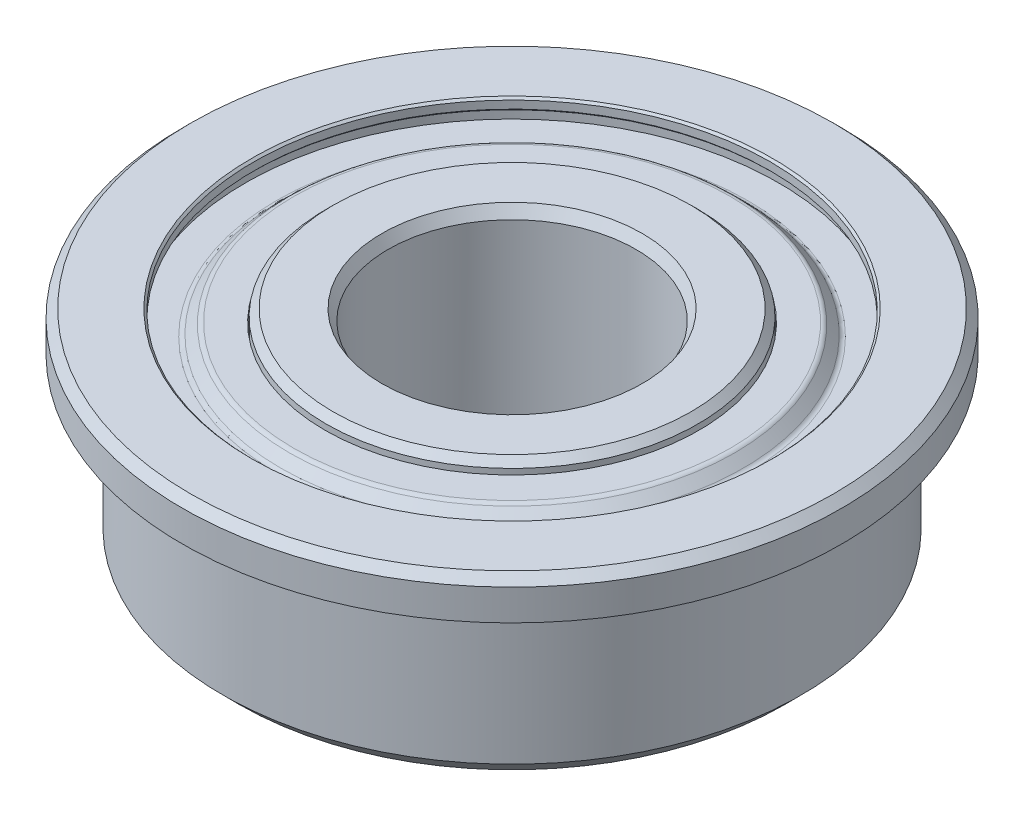
ISO-10303-21;
HEADER;
FILE_DESCRIPTION(('STEP AP214'),'2;1');
FILE_NAME('part.step','',(''),(''),'','','');
FILE_SCHEMA(('AUTOMOTIVE_DESIGN { 1 0 10303 214 1 1 1 1 }'));
ENDSEC;
DATA;
#1=APPLICATION_CONTEXT('core data for automotive mechanical design processes');
#2=APPLICATION_PROTOCOL_DEFINITION('international standard','automotive_design',2000,#1);
#3=PRODUCT_CONTEXT('',#1,'mechanical');
#4=PRODUCT('Part','Part','',(#3));
#5=PRODUCT_RELATED_PRODUCT_CATEGORY('part','',(#4));
#6=PRODUCT_DEFINITION_FORMATION('','',#4);
#7=PRODUCT_DEFINITION_CONTEXT('part definition',#1,'design');
#8=PRODUCT_DEFINITION('design','',#6,#7);
#9=PRODUCT_DEFINITION_SHAPE('','',#8);
#10=(LENGTH_UNIT() NAMED_UNIT(*) SI_UNIT(.MILLI.,.METRE.));
#11=(NAMED_UNIT(*) PLANE_ANGLE_UNIT() SI_UNIT($,.RADIAN.));
#12=(NAMED_UNIT(*) SI_UNIT($,.STERADIAN.) SOLID_ANGLE_UNIT());
#13=UNCERTAINTY_MEASURE_WITH_UNIT(LENGTH_MEASURE(1.E-05),#10,'distance_accuracy_value','');
#14=(GEOMETRIC_REPRESENTATION_CONTEXT(3) GLOBAL_UNCERTAINTY_ASSIGNED_CONTEXT((#13)) GLOBAL_UNIT_ASSIGNED_CONTEXT((#10,
#11,#12)) REPRESENTATION_CONTEXT('',''));
#15=CARTESIAN_POINT('',(0.,0.,0.));
#16=DIRECTION('',(0.,0.,1.));
#17=DIRECTION('',(1.,0.,0.));
#18=AXIS2_PLACEMENT_3D('',#15,#16,#17);
#19=CARTESIAN_POINT('',(0.,4.8300000000836,0.));
#20=DIRECTION('',(0.,-1.,0.));
#21=DIRECTION('',(0.,0.,-1.));
#22=AXIS2_PLACEMENT_3D('',#19,#20,#21);
#23=CONICAL_SURFACE('',#22,4.49999999983675,0.785398163397448);
#24=CARTESIAN_POINT('',(0.,4.83,0.));
#25=DIRECTION('',(0.,1.,0.));
#26=DIRECTION('',(0.,0.,1.));
#27=AXIS2_PLACEMENT_3D('',#24,#25,#26);
#28=CIRCLE('',#27,4.5);
#29=CARTESIAN_POINT('',(0.,4.83,4.5));
#30=VERTEX_POINT('',#29);
#31=EDGE_CURVE('E410',#30,#30,#28,.F.);
#32=ORIENTED_EDGE('',*,*,#31,.F.);
#33=EDGE_LOOP('',(#32));
#34=FACE_BOUND('',#33,.T.);
#35=CARTESIAN_POINT('',(0.,4.99999999999545,0.));
#36=DIRECTION('',(0.,-1.,0.));
#37=DIRECTION('',(0.,0.,-1.));
#38=AXIS2_PLACEMENT_3D('',#35,#36,#37);
#39=CIRCLE('',#38,4.32999999992489);
#40=CARTESIAN_POINT('',(0.,4.99999999999545,-4.32999999992489));
#41=VERTEX_POINT('',#40);
#42=EDGE_CURVE('E408',#41,#41,#39,.F.);
#43=ORIENTED_EDGE('',*,*,#42,.F.);
#44=EDGE_LOOP('',(#43));
#45=FACE_BOUND('',#44,.T.);
#46=ADVANCED_FACE('F17',(#34,#45),#23,.T.);
#47=CARTESIAN_POINT('',(0.,4.71,0.));
#48=DIRECTION('',(0.,1.,0.));
#49=DIRECTION('',(0.,0.,1.));
#50=AXIS2_PLACEMENT_3D('',#47,#48,#49);
#51=CYLINDRICAL_SURFACE('',#50,4.5);
#52=ORIENTED_EDGE('',*,*,#31,.T.);
#53=EDGE_LOOP('',(#52));
#54=FACE_BOUND('',#53,.T.);
#55=CARTESIAN_POINT('',(0.,4.456,0.));
#56=DIRECTION('',(0.,1.,0.));
#57=DIRECTION('',(0.,0.,1.));
#58=AXIS2_PLACEMENT_3D('',#55,#56,#57);
#59=CIRCLE('',#58,4.5);
#60=CARTESIAN_POINT('',(0.,4.456,4.5));
#61=VERTEX_POINT('',#60);
#62=EDGE_CURVE('E406',#61,#61,#59,.F.);
#63=ORIENTED_EDGE('',*,*,#62,.F.);
#64=EDGE_LOOP('',(#63));
#65=FACE_BOUND('',#64,.T.);
#66=ADVANCED_FACE('F127',(#54,#65),#51,.T.);
#67=CARTESIAN_POINT('',(0.,5.,0.));
#68=DIRECTION('',(0.,1.,0.));
#69=DIRECTION('',(0.,0.,1.));
#70=AXIS2_PLACEMENT_3D('',#67,#68,#69);
#71=PLANE('',#70);
#72=CARTESIAN_POINT('',(0.,5.0000000000523,0.));
#73=DIRECTION('',(0.,1.,0.));
#74=DIRECTION('',(0.,0.,1.));
#75=AXIS2_PLACEMENT_3D('',#72,#73,#74);
#76=CIRCLE('',#75,3.15000000000509);
#77=CARTESIAN_POINT('',(0.,5.0000000000523,3.15000000000509));
#78=VERTEX_POINT('',#77);
#79=EDGE_CURVE('E403',#78,#78,#76,.F.);
#80=ORIENTED_EDGE('',*,*,#79,.T.);
#81=EDGE_LOOP('',(#80));
#82=FACE_BOUND('',#81,.T.);
#83=ORIENTED_EDGE('',*,*,#42,.T.);
#84=EDGE_LOOP('',(#83));
#85=FACE_BOUND('',#84,.T.);
#86=ADVANCED_FACE('F124',(#82,#85),#71,.T.);
#87=CARTESIAN_POINT('',(0.,4.456,0.));
#88=DIRECTION('',(0.,1.,0.));
#89=DIRECTION('',(0.,0.,1.));
#90=AXIS2_PLACEMENT_3D('',#87,#88,#89);
#91=PLANE('',#90);
#92=CARTESIAN_POINT('',(0.,4.456,0.));
#93=DIRECTION('',(0.,1.,0.));
#94=DIRECTION('',(0.,0.,1.));
#95=AXIS2_PLACEMENT_3D('',#92,#93,#94);
#96=CIRCLE('',#95,4.525);
#97=CARTESIAN_POINT('',(0.,4.456,4.525));
#98=VERTEX_POINT('',#97);
#99=EDGE_CURVE('E400',#98,#98,#96,.T.);
#100=ORIENTED_EDGE('',*,*,#99,.T.);
#101=EDGE_LOOP('',(#100));
#102=FACE_BOUND('',#101,.T.);
#103=ORIENTED_EDGE('',*,*,#62,.T.);
#104=EDGE_LOOP('',(#103));
#105=FACE_BOUND('',#104,.T.);
#106=ADVANCED_FACE('F120',(#102,#105),#91,.T.);
#107=CARTESIAN_POINT('',(0.,5.0000000000523,0.));
#108=DIRECTION('',(0.,1.,0.));
#109=DIRECTION('',(0.,0.,1.));
#110=AXIS2_PLACEMENT_3D('',#107,#108,#109);
#111=CONICAL_SURFACE('',#110,3.15000000000509,0.523598775631897);
#112=ORIENTED_EDGE('',*,*,#79,.F.);
#113=EDGE_LOOP('',(#112));
#114=FACE_BOUND('',#113,.T.);
#115=CARTESIAN_POINT('',(0.,4.74019237886467,0.));
#116=DIRECTION('',(0.,1.,0.));
#117=DIRECTION('',(0.,0.,1.));
#118=AXIS2_PLACEMENT_3D('',#115,#116,#117);
#119=CIRCLE('',#118,3.);
#120=CARTESIAN_POINT('',(0.,4.74019237886467,3.));
#121=VERTEX_POINT('',#120);
#122=EDGE_CURVE('E399',#121,#121,#119,.F.);
#123=ORIENTED_EDGE('',*,*,#122,.T.);
#124=EDGE_LOOP('',(#123));
#125=FACE_BOUND('',#124,.T.);
#126=ADVANCED_FACE('F116',(#114,#125),#111,.F.);
#127=CARTESIAN_POINT('',(0.,4.456,0.));
#128=DIRECTION('',(0.,1.,0.));
#129=DIRECTION('',(0.,0.,1.));
#130=AXIS2_PLACEMENT_3D('',#127,#128,#129);
#131=CYLINDRICAL_SURFACE('',#130,4.525);
#132=CARTESIAN_POINT('',(0.,4.71,0.));
#133=DIRECTION('',(0.,1.,0.));
#134=DIRECTION('',(0.,0.,1.));
#135=AXIS2_PLACEMENT_3D('',#132,#133,#134);
#136=CIRCLE('',#135,4.525);
#137=CARTESIAN_POINT('',(0.,4.71,4.525));
#138=VERTEX_POINT('',#137);
#139=EDGE_CURVE('E396',#138,#138,#136,.F.);
#140=ORIENTED_EDGE('',*,*,#139,.F.);
#141=EDGE_LOOP('',(#140));
#142=FACE_BOUND('',#141,.T.);
#143=ORIENTED_EDGE('',*,*,#99,.F.);
#144=EDGE_LOOP('',(#143));
#145=FACE_BOUND('',#144,.T.);
#146=ADVANCED_FACE('F112',(#142,#145),#131,.F.);
#147=CARTESIAN_POINT('',(0.,0.,0.));
#148=DIRECTION('',(0.,1.,0.));
#149=DIRECTION('',(0.,0.,1.));
#150=AXIS2_PLACEMENT_3D('',#147,#148,#149);
#151=CYLINDRICAL_SURFACE('',#150,3.);
#152=ORIENTED_EDGE('',*,*,#122,.F.);
#153=EDGE_LOOP('',(#152));
#154=FACE_BOUND('',#153,.T.);
#155=CARTESIAN_POINT('',(0.,0.259807621148411,0.));
#156=DIRECTION('',(0.,-1.,0.));
#157=DIRECTION('',(0.,0.,-1.));
#158=AXIS2_PLACEMENT_3D('',#155,#156,#157);
#159=CIRCLE('',#158,3.00000000004275);
#160=CARTESIAN_POINT('',(0.,0.259807621148411,-3.00000000004275));
#161=VERTEX_POINT('',#160);
#162=EDGE_CURVE('E65',#161,#161,#159,.T.);
#163=ORIENTED_EDGE('',*,*,#162,.T.);
#164=EDGE_LOOP('',(#163));
#165=FACE_BOUND('',#164,.T.);
#166=ADVANCED_FACE('F108',(#154,#165),#151,.F.);
#167=CARTESIAN_POINT('',(0.,4.71,0.));
#168=DIRECTION('',(0.,1.,0.));
#169=DIRECTION('',(0.,0.,1.));
#170=AXIS2_PLACEMENT_3D('',#167,#168,#169);
#171=PLANE('',#170);
#172=CARTESIAN_POINT('',(0.,4.71,0.));
#173=DIRECTION('',(0.,-1.,0.));
#174=DIRECTION('',(0.,0.,-1.));
#175=AXIS2_PLACEMENT_3D('',#172,#173,#174);
#176=CIRCLE('',#175,5.27978129677862);
#177=CARTESIAN_POINT('',(0.,4.71,-5.27978129677862));
#178=VERTEX_POINT('',#177);
#179=CARTESIAN_POINT('',(0.,4.71,5.27978129677862));
#180=VERTEX_POINT('',#179);
#181=EDGE_CURVE('E63',#178,#180,#176,.T.);
#182=ORIENTED_EDGE('',*,*,#181,.F.);
#183=CARTESIAN_POINT('',(0.,4.71,0.));
#184=DIRECTION('',(0.,-1.,0.));
#185=DIRECTION('',(0.,0.,1.));
#186=AXIS2_PLACEMENT_3D('',#183,#184,#185);
#187=CIRCLE('',#186,5.27978129677862);
#188=EDGE_CURVE('E57',#180,#178,#187,.T.);
#189=ORIENTED_EDGE('',*,*,#188,.F.);
#190=EDGE_LOOP('',(#182,#189));
#191=FACE_BOUND('',#190,.T.);
#192=ORIENTED_EDGE('',*,*,#139,.T.);
#193=EDGE_LOOP('',(#192));
#194=FACE_BOUND('',#193,.T.);
#195=ADVANCED_FACE('F61',(#191,#194),#171,.T.);
#196=CARTESIAN_POINT('',(0.,5.6843418860808E-11,0.));
#197=DIRECTION('',(0.,-1.,0.));
#198=DIRECTION('',(0.,0.,-1.));
#199=AXIS2_PLACEMENT_3D('',#196,#197,#198);
#200=CONICAL_SURFACE('',#199,3.15000000000509,0.523598775562543);
#201=CARTESIAN_POINT('',(0.,5.6843418860808E-11,0.));
#202=DIRECTION('',(0.,-1.,0.));
#203=DIRECTION('',(0.,0.,-1.));
#204=AXIS2_PLACEMENT_3D('',#201,#202,#203);
#205=CIRCLE('',#204,3.15000000000509);
#206=CARTESIAN_POINT('',(0.,5.6843418860808E-11,-3.15000000000509));
#207=VERTEX_POINT('',#206);
#208=EDGE_CURVE('E71',#207,#207,#205,.T.);
#209=ORIENTED_EDGE('',*,*,#208,.T.);
#210=EDGE_LOOP('',(#209));
#211=FACE_BOUND('',#210,.T.);
#212=ORIENTED_EDGE('',*,*,#162,.F.);
#213=EDGE_LOOP('',(#212));
#214=FACE_BOUND('',#213,.T.);
#215=ADVANCED_FACE('F91',(#211,#214),#200,.F.);
#216=CARTESIAN_POINT('',(0.,4.56,0.));
#217=DIRECTION('',(0.,1.,0.));
#218=DIRECTION('',(0.,0.,1.));
#219=AXIS2_PLACEMENT_3D('',#216,#217,#218);
#220=TOROIDAL_SURFACE('',#219,5.27978129677862,0.15);
#221=ORIENTED_EDGE('',*,*,#188,.T.);
#222=ORIENTED_EDGE('',*,*,#181,.T.);
#223=EDGE_LOOP('',(#221,#222));
#224=FACE_BOUND('',#223,.T.);
#225=CARTESIAN_POINT('',(0.,4.66606601713693,0.));
#226=DIRECTION('',(0.,-1.,0.));
#227=DIRECTION('',(0.,0.,-1.));
#228=AXIS2_PLACEMENT_3D('',#225,#226,#227);
#229=CIRCLE('',#228,5.38584731390301);
#230=CARTESIAN_POINT('',(0.,4.66606601713693,-5.38584731390301));
#231=VERTEX_POINT('',#230);
#232=EDGE_CURVE('E96',#231,#231,#229,.T.);
#233=ORIENTED_EDGE('',*,*,#232,.F.);
#234=EDGE_LOOP('',(#233));
#235=FACE_BOUND('',#234,.T.);
#236=ADVANCED_FACE('F69',(#224,#235),#220,.T.);
#237=CARTESIAN_POINT('',(0.,0.,0.));
#238=DIRECTION('',(0.,1.,0.));
#239=DIRECTION('',(0.,0.,1.));
#240=AXIS2_PLACEMENT_3D('',#237,#238,#239);
#241=PLANE('',#240);
#242=ORIENTED_EDGE('',*,*,#208,.F.);
#243=EDGE_LOOP('',(#242));
#244=FACE_BOUND('',#243,.T.);
#245=CARTESIAN_POINT('',(0.,0.,0.));
#246=DIRECTION('',(0.,1.,0.));
#247=DIRECTION('',(0.,0.,1.));
#248=AXIS2_PLACEMENT_3D('',#245,#246,#247);
#249=CIRCLE('',#248,4.32999999992489);
#250=CARTESIAN_POINT('',(0.,0.,4.32999999992489));
#251=VERTEX_POINT('',#250);
#252=EDGE_CURVE('E382',#251,#251,#249,.T.);
#253=ORIENTED_EDGE('',*,*,#252,.F.);
#254=EDGE_LOOP('',(#253));
#255=FACE_BOUND('',#254,.T.);
#256=ADVANCED_FACE('F90',(#244,#255),#241,.F.);
#257=CARTESIAN_POINT('',(0.,4.45393398274518,0.));
#258=DIRECTION('',(0.,-1.,0.));
#259=DIRECTION('',(0.,0.,-1.));
#260=AXIS2_PLACEMENT_3D('',#257,#258,#259);
#261=CONICAL_SURFACE('',#260,5.59797934829476,0.785398163397448);
#262=CARTESIAN_POINT('',(0.,4.45393398282202,0.));
#263=DIRECTION('',(0.,1.,0.));
#264=DIRECTION('',(0.,0.,1.));
#265=AXIS2_PLACEMENT_3D('',#262,#263,#264);
#266=CIRCLE('',#265,5.59797934831256);
#267=CARTESIAN_POINT('',(0.,4.45393398282202,5.59797934831256));
#268=VERTEX_POINT('',#267);
#269=EDGE_CURVE('E380',#268,#268,#266,.T.);
#270=ORIENTED_EDGE('',*,*,#269,.T.);
#271=EDGE_LOOP('',(#270));
#272=FACE_BOUND('',#271,.T.);
#273=ORIENTED_EDGE('',*,*,#232,.T.);
#274=EDGE_LOOP('',(#273));
#275=FACE_BOUND('',#274,.T.);
#276=ADVANCED_FACE('F483',(#272,#275),#261,.T.);
#277=CARTESIAN_POINT('',(0.,0.170000000025539,0.));
#278=DIRECTION('',(0.,1.,0.));
#279=DIRECTION('',(0.,0.,1.));
#280=AXIS2_PLACEMENT_3D('',#277,#278,#279);
#281=CONICAL_SURFACE('',#280,4.50000000000728,0.785398163564635);
#282=ORIENTED_EDGE('',*,*,#252,.T.);
#283=EDGE_LOOP('',(#282));
#284=FACE_BOUND('',#283,.T.);
#285=CARTESIAN_POINT('',(0.,0.170000000000001,0.));
#286=DIRECTION('',(0.,-1.,0.));
#287=DIRECTION('',(0.,0.,-1.));
#288=AXIS2_PLACEMENT_3D('',#285,#286,#287);
#289=CIRCLE('',#288,4.5);
#290=CARTESIAN_POINT('',(0.,0.170000000000001,-4.5));
#291=VERTEX_POINT('',#290);
#292=EDGE_CURVE('E373',#291,#291,#289,.F.);
#293=ORIENTED_EDGE('',*,*,#292,.F.);
#294=EDGE_LOOP('',(#293));
#295=FACE_BOUND('',#294,.T.);
#296=ADVANCED_FACE('F360',(#284,#295),#281,.T.);
#297=CARTESIAN_POINT('',(0.,4.56,0.));
#298=DIRECTION('',(0.,1.,0.));
#299=DIRECTION('',(0.,0.,1.));
#300=AXIS2_PLACEMENT_3D('',#297,#298,#299);
#301=TOROIDAL_SURFACE('',#300,5.70404536549055,0.15);
#302=ORIENTED_EDGE('',*,*,#269,.F.);
#303=EDGE_LOOP('',(#302));
#304=FACE_BOUND('',#303,.T.);
#305=CARTESIAN_POINT('',(0.,4.41,0.));
#306=DIRECTION('',(0.,1.,0.));
#307=DIRECTION('',(0.,0.,-1.));
#308=AXIS2_PLACEMENT_3D('',#305,#306,#307);
#309=CIRCLE('',#308,5.70404536549055);
#310=CARTESIAN_POINT('',(0.,4.41,5.70404536549055));
#311=VERTEX_POINT('',#310);
#312=CARTESIAN_POINT('',(0.,4.41,-5.70404536549055));
#313=VERTEX_POINT('',#312);
#314=EDGE_CURVE('E323',#311,#313,#309,.F.);
#315=ORIENTED_EDGE('',*,*,#314,.F.);
#316=CARTESIAN_POINT('',(0.,4.41,0.));
#317=DIRECTION('',(0.,1.,0.));
#318=DIRECTION('',(0.,0.,1.));
#319=AXIS2_PLACEMENT_3D('',#316,#317,#318);
#320=CIRCLE('',#319,5.70404536549055);
#321=EDGE_CURVE('E473',#313,#311,#320,.F.);
#322=ORIENTED_EDGE('',*,*,#321,.F.);
#323=EDGE_LOOP('',(#315,#322));
#324=FACE_BOUND('',#323,.T.);
#325=ADVANCED_FACE('F356',(#304,#324),#301,.F.);
#326=CARTESIAN_POINT('',(0.,0.3,0.));
#327=DIRECTION('',(0.,-1.,0.));
#328=DIRECTION('',(0.,0.,-1.));
#329=AXIS2_PLACEMENT_3D('',#326,#327,#328);
#330=CYLINDRICAL_SURFACE('',#329,4.5);
#331=CARTESIAN_POINT('',(0.,0.544,0.));
#332=DIRECTION('',(0.,-1.,0.));
#333=DIRECTION('',(0.,0.,-1.));
#334=AXIS2_PLACEMENT_3D('',#331,#332,#333);
#335=CIRCLE('',#334,4.5);
#336=CARTESIAN_POINT('',(0.,0.544,-4.5));
#337=VERTEX_POINT('',#336);
#338=EDGE_CURVE('E392',#337,#337,#335,.F.);
#339=ORIENTED_EDGE('',*,*,#338,.F.);
#340=EDGE_LOOP('',(#339));
#341=FACE_BOUND('',#340,.T.);
#342=ORIENTED_EDGE('',*,*,#292,.T.);
#343=EDGE_LOOP('',(#342));
#344=FACE_BOUND('',#343,.T.);
#345=ADVANCED_FACE('F340',(#341,#344),#330,.T.);
#346=CARTESIAN_POINT('',(0.,4.41,0.));
#347=DIRECTION('',(0.,1.,0.));
#348=DIRECTION('',(0.,0.,1.));
#349=AXIS2_PLACEMENT_3D('',#346,#347,#348);
#350=PLANE('',#349);
#351=CARTESIAN_POINT('',(0.,4.41,0.));
#352=DIRECTION('',(0.,1.,0.));
#353=DIRECTION('',(0.,0.,1.));
#354=AXIS2_PLACEMENT_3D('',#351,#352,#353);
#355=CIRCLE('',#354,6.45);
#356=CARTESIAN_POINT('',(0.,4.41,6.45));
#357=VERTEX_POINT('',#356);
#358=EDGE_CURVE('E469',#357,#357,#355,.T.);
#359=ORIENTED_EDGE('',*,*,#358,.T.);
#360=EDGE_LOOP('',(#359));
#361=FACE_BOUND('',#360,.T.);
#362=ORIENTED_EDGE('',*,*,#314,.T.);
#363=ORIENTED_EDGE('',*,*,#321,.T.);
#364=EDGE_LOOP('',(#362,#363));
#365=FACE_BOUND('',#364,.T.);
#366=ADVANCED_FACE('F329',(#361,#365),#350,.T.);
#367=CARTESIAN_POINT('',(0.,0.544,0.));
#368=DIRECTION('',(0.,-1.,0.));
#369=DIRECTION('',(0.,0.,-1.));
#370=AXIS2_PLACEMENT_3D('',#367,#368,#369);
#371=PLANE('',#370);
#372=CARTESIAN_POINT('',(0.,0.544,0.));
#373=DIRECTION('',(0.,-1.,0.));
#374=DIRECTION('',(0.,0.,-1.));
#375=AXIS2_PLACEMENT_3D('',#372,#373,#374);
#376=CIRCLE('',#375,4.525);
#377=CARTESIAN_POINT('',(0.,0.544,-4.525));
#378=VERTEX_POINT('',#377);
#379=EDGE_CURVE('E467',#378,#378,#376,.T.);
#380=ORIENTED_EDGE('',*,*,#379,.T.);
#381=EDGE_LOOP('',(#380));
#382=FACE_BOUND('',#381,.T.);
#383=ORIENTED_EDGE('',*,*,#338,.T.);
#384=EDGE_LOOP('',(#383));
#385=FACE_BOUND('',#384,.T.);
#386=ADVANCED_FACE('F339',(#382,#385),#371,.T.);
#387=CARTESIAN_POINT('',(0.,4.41,0.));
#388=DIRECTION('',(0.,1.,0.));
#389=DIRECTION('',(0.,0.,1.));
#390=AXIS2_PLACEMENT_3D('',#387,#388,#389);
#391=CYLINDRICAL_SURFACE('',#390,6.45);
#392=ORIENTED_EDGE('',*,*,#358,.F.);
#393=EDGE_LOOP('',(#392));
#394=FACE_BOUND('',#393,.T.);
#395=CARTESIAN_POINT('',(0.,4.71,0.));
#396=DIRECTION('',(0.,1.,0.));
#397=DIRECTION('',(0.,0.,1.));
#398=AXIS2_PLACEMENT_3D('',#395,#396,#397);
#399=CIRCLE('',#398,6.45);
#400=CARTESIAN_POINT('',(0.,4.71,6.45));
#401=VERTEX_POINT('',#400);
#402=EDGE_CURVE('E464',#401,#401,#399,.T.);
#403=ORIENTED_EDGE('',*,*,#402,.T.);
#404=EDGE_LOOP('',(#403));
#405=FACE_BOUND('',#404,.T.);
#406=ADVANCED_FACE('F555',(#394,#405),#391,.F.);
#407=CARTESIAN_POINT('',(0.,0.544,0.));
#408=DIRECTION('',(0.,-1.,0.));
#409=DIRECTION('',(0.,0.,-1.));
#410=AXIS2_PLACEMENT_3D('',#407,#408,#409);
#411=CYLINDRICAL_SURFACE('',#410,4.525);
#412=ORIENTED_EDGE('',*,*,#379,.F.);
#413=EDGE_LOOP('',(#412));
#414=FACE_BOUND('',#413,.T.);
#415=CARTESIAN_POINT('',(0.,0.3,0.));
#416=DIRECTION('',(0.,-1.,0.));
#417=DIRECTION('',(0.,0.,-1.));
#418=AXIS2_PLACEMENT_3D('',#415,#416,#417);
#419=CIRCLE('',#418,4.525);
#420=CARTESIAN_POINT('',(0.,0.3,-4.525));
#421=VERTEX_POINT('',#420);
#422=EDGE_CURVE('E461',#421,#421,#419,.F.);
#423=ORIENTED_EDGE('',*,*,#422,.F.);
#424=EDGE_LOOP('',(#423));
#425=FACE_BOUND('',#424,.T.);
#426=ADVANCED_FACE('F564',(#414,#425),#411,.F.);
#427=CARTESIAN_POINT('',(0.,4.71,0.));
#428=DIRECTION('',(0.,1.,0.));
#429=DIRECTION('',(0.,0.,1.));
#430=AXIS2_PLACEMENT_3D('',#427,#428,#429);
#431=PLANE('',#430);
#432=ORIENTED_EDGE('',*,*,#402,.F.);
#433=EDGE_LOOP('',(#432));
#434=FACE_BOUND('',#433,.T.);
#435=CARTESIAN_POINT('',(0.,4.70999999998867,0.));
#436=DIRECTION('',(0.,-1.,0.));
#437=DIRECTION('',(0.,0.,-1.));
#438=AXIS2_PLACEMENT_3D('',#435,#436,#437);
#439=CIRCLE('',#438,6.29999999995334);
#440=CARTESIAN_POINT('',(0.,4.70999999998867,-6.29999999995334));
#441=VERTEX_POINT('',#440);
#442=EDGE_CURVE('E458',#441,#441,#439,.F.);
#443=ORIENTED_EDGE('',*,*,#442,.T.);
#444=EDGE_LOOP('',(#443));
#445=FACE_BOUND('',#444,.T.);
#446=ADVANCED_FACE('F299',(#434,#445),#431,.F.);
#447=CARTESIAN_POINT('',(0.,0.3,0.));
#448=DIRECTION('',(0.,-1.,0.));
#449=DIRECTION('',(0.,0.,-1.));
#450=AXIS2_PLACEMENT_3D('',#447,#448,#449);
#451=PLANE('',#450);
#452=ORIENTED_EDGE('',*,*,#422,.T.);
#453=EDGE_LOOP('',(#452));
#454=FACE_BOUND('',#453,.T.);
#455=CARTESIAN_POINT('',(0.,0.3,0.));
#456=DIRECTION('',(0.,1.,0.));
#457=DIRECTION('',(0.,0.,1.));
#458=AXIS2_PLACEMENT_3D('',#455,#456,#457);
#459=CIRCLE('',#458,5.27978129677861);
#460=CARTESIAN_POINT('',(0.,0.3,5.27978129677861));
#461=VERTEX_POINT('',#460);
#462=CARTESIAN_POINT('',(0.,0.3,-5.27978129677861));
#463=VERTEX_POINT('',#462);
#464=EDGE_CURVE('E283',#461,#463,#459,.T.);
#465=ORIENTED_EDGE('',*,*,#464,.F.);
#466=CARTESIAN_POINT('',(0.,0.3,0.));
#467=DIRECTION('',(0.,1.,0.));
#468=DIRECTION('',(0.,0.,-1.));
#469=AXIS2_PLACEMENT_3D('',#466,#467,#468);
#470=CIRCLE('',#469,5.27978129677861);
#471=EDGE_CURVE('E252',#463,#461,#470,.T.);
#472=ORIENTED_EDGE('',*,*,#471,.F.);
#473=EDGE_LOOP('',(#465,#472));
#474=FACE_BOUND('',#473,.T.);
#475=ADVANCED_FACE('F290',(#454,#474),#451,.T.);
#476=CARTESIAN_POINT('',(0.,4.70999999998867,0.));
#477=DIRECTION('',(0.,-1.,0.));
#478=DIRECTION('',(0.,0.,-1.));
#479=AXIS2_PLACEMENT_3D('',#476,#477,#478);
#480=CONICAL_SURFACE('',#479,6.29999999995334,0.785398163397448);
#481=CARTESIAN_POINT('',(0.,4.76,0.));
#482=DIRECTION('',(0.,1.,0.));
#483=DIRECTION('',(0.,0.,1.));
#484=AXIS2_PLACEMENT_3D('',#481,#482,#483);
#485=CIRCLE('',#484,6.25);
#486=CARTESIAN_POINT('',(0.,4.76,6.25));
#487=VERTEX_POINT('',#486);
#488=EDGE_CURVE('E280',#487,#487,#485,.T.);
#489=ORIENTED_EDGE('',*,*,#488,.T.);
#490=EDGE_LOOP('',(#489));
#491=FACE_BOUND('',#490,.T.);
#492=ORIENTED_EDGE('',*,*,#442,.F.);
#493=EDGE_LOOP('',(#492));
#494=FACE_BOUND('',#493,.T.);
#495=ADVANCED_FACE('F271',(#491,#494),#480,.F.);
#496=CARTESIAN_POINT('',(0.,0.45,0.));
#497=DIRECTION('',(0.,-1.,0.));
#498=DIRECTION('',(0.,0.,-1.));
#499=AXIS2_PLACEMENT_3D('',#496,#497,#498);
#500=TOROIDAL_SURFACE('',#499,5.27978129677861,0.15);
#501=ORIENTED_EDGE('',*,*,#471,.T.);
#502=ORIENTED_EDGE('',*,*,#464,.T.);
#503=EDGE_LOOP('',(#501,#502));
#504=FACE_BOUND('',#503,.T.);
#505=CARTESIAN_POINT('',(0.,0.343933982776434,0.));
#506=DIRECTION('',(0.,1.,0.));
#507=DIRECTION('',(0.,0.,1.));
#508=AXIS2_PLACEMENT_3D('',#505,#506,#507);
#509=CIRCLE('',#508,5.38584731390301);
#510=CARTESIAN_POINT('',(0.,0.343933982776434,5.38584731390301));
#511=VERTEX_POINT('',#510);
#512=EDGE_CURVE('E278',#511,#511,#509,.T.);
#513=ORIENTED_EDGE('',*,*,#512,.F.);
#514=EDGE_LOOP('',(#513));
#515=FACE_BOUND('',#514,.T.);
#516=ADVANCED_FACE('F259',(#504,#515),#500,.T.);
#517=CARTESIAN_POINT('',(0.,4.71,0.));
#518=DIRECTION('',(0.,1.,0.));
#519=DIRECTION('',(0.,0.,1.));
#520=AXIS2_PLACEMENT_3D('',#517,#518,#519);
#521=CYLINDRICAL_SURFACE('',#520,6.25);
#522=ORIENTED_EDGE('',*,*,#488,.F.);
#523=EDGE_LOOP('',(#522));
#524=FACE_BOUND('',#523,.T.);
#525=CARTESIAN_POINT('',(0.,4.950000000008,0.));
#526=DIRECTION('',(0.,1.,0.));
#527=DIRECTION('',(0.,0.,1.));
#528=AXIS2_PLACEMENT_3D('',#525,#526,#527);
#529=CIRCLE('',#528,6.24999999996589);
#530=CARTESIAN_POINT('',(0.,4.950000000008,6.24999999996589));
#531=VERTEX_POINT('',#530);
#532=EDGE_CURVE('E768',#531,#531,#529,.T.);
#533=ORIENTED_EDGE('',*,*,#532,.T.);
#534=EDGE_LOOP('',(#533));
#535=FACE_BOUND('',#534,.T.);
#536=ADVANCED_FACE('F270',(#524,#535),#521,.F.);
#537=CARTESIAN_POINT('',(0.,0.546066017193425,0.));
#538=DIRECTION('',(0.,1.,0.));
#539=DIRECTION('',(0.,0.,1.));
#540=AXIS2_PLACEMENT_3D('',#537,#538,#539);
#541=CONICAL_SURFACE('',#540,5.58797934837685,0.785398163538058);
#542=CARTESIAN_POINT('',(0.,0.546066017177981,0.));
#543=DIRECTION('',(0.,-1.,0.));
#544=DIRECTION('',(0.,0.,-1.));
#545=AXIS2_PLACEMENT_3D('',#542,#543,#544);
#546=CIRCLE('',#545,5.58797934831256);
#547=CARTESIAN_POINT('',(0.,0.546066017177981,-5.58797934831256));
#548=VERTEX_POINT('',#547);
#549=EDGE_CURVE('E457',#548,#548,#546,.T.);
#550=ORIENTED_EDGE('',*,*,#549,.T.);
#551=EDGE_LOOP('',(#550));
#552=FACE_BOUND('',#551,.T.);
#553=ORIENTED_EDGE('',*,*,#512,.T.);
#554=EDGE_LOOP('',(#553));
#555=FACE_BOUND('',#554,.T.);
#556=ADVANCED_FACE('F609',(#552,#555),#541,.T.);
#557=CARTESIAN_POINT('',(0.,4.99999999999545,0.));
#558=DIRECTION('',(0.,1.,0.));
#559=DIRECTION('',(0.,0.,1.));
#560=AXIS2_PLACEMENT_3D('',#557,#558,#559);
#561=CONICAL_SURFACE('',#560,6.29999999995334,0.785398163397448);
#562=ORIENTED_EDGE('',*,*,#532,.F.);
#563=EDGE_LOOP('',(#562));
#564=FACE_BOUND('',#563,.T.);
#565=CARTESIAN_POINT('',(0.,4.99999999999545,0.));
#566=DIRECTION('',(0.,1.,0.));
#567=DIRECTION('',(0.,0.,1.));
#568=AXIS2_PLACEMENT_3D('',#565,#566,#567);
#569=CIRCLE('',#568,6.29999999995334);
#570=CARTESIAN_POINT('',(0.,4.99999999999545,6.29999999995334));
#571=VERTEX_POINT('',#570);
#572=EDGE_CURVE('E453',#571,#571,#569,.F.);
#573=ORIENTED_EDGE('',*,*,#572,.F.);
#574=EDGE_LOOP('',(#573));
#575=FACE_BOUND('',#574,.T.);
#576=ADVANCED_FACE('F231',(#564,#575),#561,.F.);
#577=CARTESIAN_POINT('',(0.,0.44,0.));
#578=DIRECTION('',(0.,-1.,0.));
#579=DIRECTION('',(0.,0.,-1.));
#580=AXIS2_PLACEMENT_3D('',#577,#578,#579);
#581=TOROIDAL_SURFACE('',#580,5.69404536549054,0.15);
#582=ORIENTED_EDGE('',*,*,#549,.F.);
#583=EDGE_LOOP('',(#582));
#584=FACE_BOUND('',#583,.T.);
#585=CARTESIAN_POINT('',(0.,0.59,0.));
#586=DIRECTION('',(0.,-1.,0.));
#587=DIRECTION('',(0.,0.,1.));
#588=AXIS2_PLACEMENT_3D('',#585,#586,#587);
#589=CIRCLE('',#588,5.69404536549054);
#590=CARTESIAN_POINT('',(0.,0.59,-5.69404536549054));
#591=VERTEX_POINT('',#590);
#592=CARTESIAN_POINT('',(0.,0.59,5.69404536549054));
#593=VERTEX_POINT('',#592);
#594=EDGE_CURVE('E456',#591,#593,#589,.F.);
#595=ORIENTED_EDGE('',*,*,#594,.F.);
#596=CARTESIAN_POINT('',(0.,0.59,0.));
#597=DIRECTION('',(0.,-1.,0.));
#598=DIRECTION('',(0.,0.,-1.));
#599=AXIS2_PLACEMENT_3D('',#596,#597,#598);
#600=CIRCLE('',#599,5.69404536549054);
#601=EDGE_CURVE('E36',#593,#591,#600,.F.);
#602=ORIENTED_EDGE('',*,*,#601,.F.);
#603=EDGE_LOOP('',(#595,#602));
#604=FACE_BOUND('',#603,.T.);
#605=ADVANCED_FACE('F227',(#584,#604),#581,.F.);
#606=CARTESIAN_POINT('',(0.,5.,0.));
#607=DIRECTION('',(0.,1.,0.));
#608=DIRECTION('',(0.,0.,1.));
#609=AXIS2_PLACEMENT_3D('',#606,#607,#608);
#610=PLANE('',#609);
#611=CARTESIAN_POINT('',(0.,5.,0.));
#612=DIRECTION('',(0.,-1.,0.));
#613=DIRECTION('',(0.,0.,-1.));
#614=AXIS2_PLACEMENT_3D('',#611,#612,#613);
#615=CIRCLE('',#614,7.77500000000001);
#616=CARTESIAN_POINT('',(0.,5.,-7.77500000000001));
#617=VERTEX_POINT('',#616);
#618=EDGE_CURVE('E450',#617,#617,#615,.T.);
#619=ORIENTED_EDGE('',*,*,#618,.F.);
#620=EDGE_LOOP('',(#619));
#621=FACE_BOUND('',#620,.T.);
#622=ORIENTED_EDGE('',*,*,#572,.T.);
#623=EDGE_LOOP('',(#622));
#624=FACE_BOUND('',#623,.T.);
#625=ADVANCED_FACE('F207',(#621,#624),#610,.T.);
#626=CARTESIAN_POINT('',(0.,0.59,0.));
#627=DIRECTION('',(0.,-1.,0.));
#628=DIRECTION('',(0.,0.,-1.));
#629=AXIS2_PLACEMENT_3D('',#626,#627,#628);
#630=PLANE('',#629);
#631=CARTESIAN_POINT('',(0.,0.59,0.));
#632=DIRECTION('',(0.,-1.,0.));
#633=DIRECTION('',(0.,0.,-1.));
#634=AXIS2_PLACEMENT_3D('',#631,#632,#633);
#635=CIRCLE('',#634,6.45);
#636=CARTESIAN_POINT('',(0.,0.59,-6.45));
#637=VERTEX_POINT('',#636);
#638=EDGE_CURVE('E447',#637,#637,#635,.T.);
#639=ORIENTED_EDGE('',*,*,#638,.T.);
#640=EDGE_LOOP('',(#639));
#641=FACE_BOUND('',#640,.T.);
#642=ORIENTED_EDGE('',*,*,#594,.T.);
#643=ORIENTED_EDGE('',*,*,#601,.T.);
#644=EDGE_LOOP('',(#642,#643));
#645=FACE_BOUND('',#644,.T.);
#646=ADVANCED_FACE('F202',(#641,#645),#630,.T.);
#647=CARTESIAN_POINT('',(0.,4.80000000000001,0.));
#648=DIRECTION('',(0.,-1.,0.));
#649=DIRECTION('',(0.,0.,-1.));
#650=AXIS2_PLACEMENT_3D('',#647,#648,#649);
#651=CONICAL_SURFACE('',#650,7.975,0.785398163397448);
#652=ORIENTED_EDGE('',*,*,#618,.T.);
#653=EDGE_LOOP('',(#652));
#654=FACE_BOUND('',#653,.T.);
#655=CARTESIAN_POINT('',(0.,4.80000000000001,0.));
#656=DIRECTION('',(0.,-1.,0.));
#657=DIRECTION('',(0.,0.,-1.));
#658=AXIS2_PLACEMENT_3D('',#655,#656,#657);
#659=CIRCLE('',#658,7.975);
#660=CARTESIAN_POINT('',(0.,4.80000000000001,-7.975));
#661=VERTEX_POINT('',#660);
#662=EDGE_CURVE('E446',#661,#661,#659,.T.);
#663=ORIENTED_EDGE('',*,*,#662,.F.);
#664=EDGE_LOOP('',(#663));
#665=FACE_BOUND('',#664,.T.);
#666=ADVANCED_FACE('F198',(#654,#665),#651,.T.);
#667=CARTESIAN_POINT('',(0.,0.59,0.));
#668=DIRECTION('',(0.,-1.,0.));
#669=DIRECTION('',(0.,0.,-1.));
#670=AXIS2_PLACEMENT_3D('',#667,#668,#669);
#671=CYLINDRICAL_SURFACE('',#670,6.45);
#672=CARTESIAN_POINT('',(0.,0.29,0.));
#673=DIRECTION('',(0.,-1.,0.));
#674=DIRECTION('',(0.,0.,-1.));
#675=AXIS2_PLACEMENT_3D('',#672,#673,#674);
#676=CIRCLE('',#675,6.45);
#677=CARTESIAN_POINT('',(0.,0.29,-6.45));
#678=VERTEX_POINT('',#677);
#679=EDGE_CURVE('E443',#678,#678,#676,.T.);
#680=ORIENTED_EDGE('',*,*,#679,.T.);
#681=EDGE_LOOP('',(#680));
#682=FACE_BOUND('',#681,.T.);
#683=ORIENTED_EDGE('',*,*,#638,.F.);
#684=EDGE_LOOP('',(#683));
#685=FACE_BOUND('',#684,.T.);
#686=ADVANCED_FACE('F194',(#682,#685),#671,.F.);
#687=CARTESIAN_POINT('',(0.,32.5567063198509,0.));
#688=DIRECTION('',(0.,-1.,0.));
#689=DIRECTION('',(0.,0.,-1.));
#690=AXIS2_PLACEMENT_3D('',#687,#688,#689);
#691=CYLINDRICAL_SURFACE('',#690,7.975);
#692=ORIENTED_EDGE('',*,*,#662,.T.);
#693=EDGE_LOOP('',(#692));
#694=FACE_BOUND('',#693,.T.);
#695=CARTESIAN_POINT('',(0.,4.05,0.));
#696=DIRECTION('',(0.,-1.,0.));
#697=DIRECTION('',(0.,0.,-1.));
#698=AXIS2_PLACEMENT_3D('',#695,#696,#697);
#699=CIRCLE('',#698,7.975);
#700=CARTESIAN_POINT('',(0.,4.05,-7.975));
#701=VERTEX_POINT('',#700);
#702=EDGE_CURVE('E440',#701,#701,#699,.F.);
#703=ORIENTED_EDGE('',*,*,#702,.T.);
#704=EDGE_LOOP('',(#703));
#705=FACE_BOUND('',#704,.T.);
#706=ADVANCED_FACE('F190',(#694,#705),#691,.T.);
#707=CARTESIAN_POINT('',(0.,0.29,0.));
#708=DIRECTION('',(0.,-1.,0.));
#709=DIRECTION('',(0.,0.,-1.));
#710=AXIS2_PLACEMENT_3D('',#707,#708,#709);
#711=PLANE('',#710);
#712=ORIENTED_EDGE('',*,*,#679,.F.);
#713=EDGE_LOOP('',(#712));
#714=FACE_BOUND('',#713,.T.);
#715=CARTESIAN_POINT('',(0.,0.290000000006785,0.));
#716=DIRECTION('',(0.,1.,0.));
#717=DIRECTION('',(0.,0.,1.));
#718=AXIS2_PLACEMENT_3D('',#715,#716,#717);
#719=CIRCLE('',#718,6.29999999995334);
#720=CARTESIAN_POINT('',(0.,0.290000000006785,6.29999999995334));
#721=VERTEX_POINT('',#720);
#722=EDGE_CURVE('E437',#721,#721,#719,.F.);
#723=ORIENTED_EDGE('',*,*,#722,.T.);
#724=EDGE_LOOP('',(#723));
#725=FACE_BOUND('',#724,.T.);
#726=ADVANCED_FACE('F186',(#714,#725),#711,.F.);
#727=CARTESIAN_POINT('',(0.,4.05,0.));
#728=DIRECTION('',(0.,1.,0.));
#729=DIRECTION('',(0.,0.,1.));
#730=AXIS2_PLACEMENT_3D('',#727,#728,#729);
#731=PLANE('',#730);
#732=ORIENTED_EDGE('',*,*,#702,.F.);
#733=EDGE_LOOP('',(#732));
#734=FACE_BOUND('',#733,.T.);
#735=CARTESIAN_POINT('',(0.,4.05,0.));
#736=DIRECTION('',(0.,-1.,0.));
#737=DIRECTION('',(0.,0.,-1.));
#738=AXIS2_PLACEMENT_3D('',#735,#736,#737);
#739=CIRCLE('',#738,7.3);
#740=CARTESIAN_POINT('',(0.,4.05,-7.3));
#741=VERTEX_POINT('',#740);
#742=EDGE_CURVE('E434',#741,#741,#739,.F.);
#743=ORIENTED_EDGE('',*,*,#742,.T.);
#744=EDGE_LOOP('',(#743));
#745=FACE_BOUND('',#744,.T.);
#746=ADVANCED_FACE('F182',(#734,#745),#731,.F.);
#747=CARTESIAN_POINT('',(0.,0.289999999949941,0.));
#748=DIRECTION('',(0.,1.,0.));
#749=DIRECTION('',(0.,0.,1.));
#750=AXIS2_PLACEMENT_3D('',#747,#748,#749);
#751=CONICAL_SURFACE('',#750,6.2999999998965,0.785398163397448);
#752=ORIENTED_EDGE('',*,*,#722,.F.);
#753=EDGE_LOOP('',(#752));
#754=FACE_BOUND('',#753,.T.);
#755=CARTESIAN_POINT('',(0.,0.240000000000005,0.));
#756=DIRECTION('',(0.,-1.,0.));
#757=DIRECTION('',(0.,0.,-1.));
#758=AXIS2_PLACEMENT_3D('',#755,#756,#757);
#759=CIRCLE('',#758,6.25);
#760=CARTESIAN_POINT('',(0.,0.240000000000005,-6.25));
#761=VERTEX_POINT('',#760);
#762=EDGE_CURVE('E433',#761,#761,#759,.T.);
#763=ORIENTED_EDGE('',*,*,#762,.T.);
#764=EDGE_LOOP('',(#763));
#765=FACE_BOUND('',#764,.T.);
#766=ADVANCED_FACE('F178',(#754,#765),#751,.F.);
#767=CARTESIAN_POINT('',(0.,4.15,0.));
#768=DIRECTION('',(0.,-1.,0.));
#769=DIRECTION('',(0.,0.,-1.));
#770=AXIS2_PLACEMENT_3D('',#767,#768,#769);
#771=CYLINDRICAL_SURFACE('',#770,7.3);
#772=ORIENTED_EDGE('',*,*,#742,.F.);
#773=EDGE_LOOP('',(#772));
#774=FACE_BOUND('',#773,.T.);
#775=CARTESIAN_POINT('',(0.,4.15,0.));
#776=DIRECTION('',(0.,-1.,0.));
#777=DIRECTION('',(0.,0.,-1.));
#778=AXIS2_PLACEMENT_3D('',#775,#776,#777);
#779=CIRCLE('',#778,7.3);
#780=CARTESIAN_POINT('',(0.,4.15,-7.3));
#781=VERTEX_POINT('',#780);
#782=EDGE_CURVE('E430',#781,#781,#779,.T.);
#783=ORIENTED_EDGE('',*,*,#782,.F.);
#784=EDGE_LOOP('',(#783));
#785=FACE_BOUND('',#784,.T.);
#786=ADVANCED_FACE('F174',(#774,#785),#771,.F.);
#787=CARTESIAN_POINT('',(0.,0.3,0.));
#788=DIRECTION('',(0.,-1.,0.));
#789=DIRECTION('',(0.,0.,-1.));
#790=AXIS2_PLACEMENT_3D('',#787,#788,#789);
#791=CYLINDRICAL_SURFACE('',#790,6.25);
#792=CARTESIAN_POINT('',(0.,0.0499999999306056,0.));
#793=DIRECTION('',(0.,-1.,0.));
#794=DIRECTION('',(0.,0.,-1.));
#795=AXIS2_PLACEMENT_3D('',#792,#793,#794);
#796=CIRCLE('',#795,6.25000000002274);
#797=CARTESIAN_POINT('',(0.,0.0499999999306056,-6.25000000002274));
#798=VERTEX_POINT('',#797);
#799=EDGE_CURVE('E429',#798,#798,#796,.T.);
#800=ORIENTED_EDGE('',*,*,#799,.T.);
#801=EDGE_LOOP('',(#800));
#802=FACE_BOUND('',#801,.T.);
#803=ORIENTED_EDGE('',*,*,#762,.F.);
#804=EDGE_LOOP('',(#803));
#805=FACE_BOUND('',#804,.T.);
#806=ADVANCED_FACE('F170',(#802,#805),#791,.F.);
#807=CARTESIAN_POINT('',(0.,4.15,0.));
#808=DIRECTION('',(0.,-1.,0.));
#809=DIRECTION('',(0.,0.,-1.));
#810=AXIS2_PLACEMENT_3D('',#807,#808,#809);
#811=PLANE('',#810);
#812=ORIENTED_EDGE('',*,*,#782,.T.);
#813=EDGE_LOOP('',(#812));
#814=FACE_BOUND('',#813,.T.);
#815=CARTESIAN_POINT('',(0.,4.15,0.));
#816=DIRECTION('',(0.,1.,0.));
#817=DIRECTION('',(0.,0.,1.));
#818=AXIS2_PLACEMENT_3D('',#815,#816,#817);
#819=CIRCLE('',#818,6.8);
#820=CARTESIAN_POINT('',(0.,4.15,6.8));
#821=VERTEX_POINT('',#820);
#822=EDGE_CURVE('E426',#821,#821,#819,.F.);
#823=ORIENTED_EDGE('',*,*,#822,.F.);
#824=EDGE_LOOP('',(#823));
#825=FACE_BOUND('',#824,.T.);
#826=ADVANCED_FACE('F166',(#814,#825),#811,.T.);
#827=CARTESIAN_POINT('',(0.,0.,0.));
#828=DIRECTION('',(0.,-1.,0.));
#829=DIRECTION('',(0.,0.,-1.));
#830=AXIS2_PLACEMENT_3D('',#827,#828,#829);
#831=CONICAL_SURFACE('',#830,6.29999999995334,0.785398163397448);
#832=CARTESIAN_POINT('',(0.,0.,0.));
#833=DIRECTION('',(0.,-1.,0.));
#834=DIRECTION('',(0.,0.,-1.));
#835=AXIS2_PLACEMENT_3D('',#832,#833,#834);
#836=CIRCLE('',#835,6.29999999995334);
#837=CARTESIAN_POINT('',(0.,0.,-6.29999999995334));
#838=VERTEX_POINT('',#837);
#839=EDGE_CURVE('E423',#838,#838,#836,.T.);
#840=ORIENTED_EDGE('',*,*,#839,.T.);
#841=EDGE_LOOP('',(#840));
#842=FACE_BOUND('',#841,.T.);
#843=ORIENTED_EDGE('',*,*,#799,.F.);
#844=EDGE_LOOP('',(#843));
#845=FACE_BOUND('',#844,.T.);
#846=ADVANCED_FACE('F162',(#842,#845),#831,.F.);
#847=CARTESIAN_POINT('',(0.,0.,0.));
#848=DIRECTION('',(0.,1.,0.));
#849=DIRECTION('',(0.,0.,1.));
#850=AXIS2_PLACEMENT_3D('',#847,#848,#849);
#851=CYLINDRICAL_SURFACE('',#850,6.8);
#852=CARTESIAN_POINT('',(0.,3.75,0.));
#853=DIRECTION('',(0.,1.,0.));
#854=DIRECTION('',(0.,0.,1.));
#855=AXIS2_PLACEMENT_3D('',#852,#853,#854);
#856=CIRCLE('',#855,6.8);
#857=CARTESIAN_POINT('',(0.,3.75,6.8));
#858=VERTEX_POINT('',#857);
#859=EDGE_CURVE('E420',#858,#858,#856,.F.);
#860=ORIENTED_EDGE('',*,*,#859,.F.);
#861=EDGE_LOOP('',(#860));
#862=FACE_BOUND('',#861,.T.);
#863=ORIENTED_EDGE('',*,*,#822,.T.);
#864=EDGE_LOOP('',(#863));
#865=FACE_BOUND('',#864,.T.);
#866=ADVANCED_FACE('F158',(#862,#865),#851,.T.);
#867=CARTESIAN_POINT('',(0.,0.,0.));
#868=DIRECTION('',(0.,1.,0.));
#869=DIRECTION('',(0.,0.,1.));
#870=AXIS2_PLACEMENT_3D('',#867,#868,#869);
#871=PLANE('',#870);
#872=CARTESIAN_POINT('',(0.,0.,0.));
#873=DIRECTION('',(0.,1.,0.));
#874=DIRECTION('',(-1.,0.,0.));
#875=AXIS2_PLACEMENT_3D('',#872,#873,#874);
#876=CIRCLE('',#875,6.6);
#877=CARTESIAN_POINT('',(-6.6,0.,0.));
#878=VERTEX_POINT('',#877);
#879=EDGE_CURVE('E417',#878,#878,#876,.T.);
#880=ORIENTED_EDGE('',*,*,#879,.F.);
#881=EDGE_LOOP('',(#880));
#882=FACE_BOUND('',#881,.T.);
#883=ORIENTED_EDGE('',*,*,#839,.F.);
#884=EDGE_LOOP('',(#883));
#885=FACE_BOUND('',#884,.T.);
#886=ADVANCED_FACE('F154',(#882,#885),#871,.F.);
#887=CARTESIAN_POINT('',(7.,3.75,0.));
#888=DIRECTION('',(0.,1.,0.));
#889=DIRECTION('',(0.,0.,1.));
#890=AXIS2_PLACEMENT_3D('',#887,#888,#889);
#891=PLANE('',#890);
#892=ORIENTED_EDGE('',*,*,#859,.T.);
#893=EDGE_LOOP('',(#892));
#894=FACE_BOUND('',#893,.T.);
#895=CARTESIAN_POINT('',(0.,3.75,0.));
#896=DIRECTION('',(0.,-1.,0.));
#897=DIRECTION('',(0.,0.,-1.));
#898=AXIS2_PLACEMENT_3D('',#895,#896,#897);
#899=CIRCLE('',#898,7.);
#900=CARTESIAN_POINT('',(0.,3.75,-7.));
#901=VERTEX_POINT('',#900);
#902=EDGE_CURVE('E28',#901,#901,#899,.T.);
#903=ORIENTED_EDGE('',*,*,#902,.F.);
#904=EDGE_LOOP('',(#903));
#905=FACE_BOUND('',#904,.T.);
#906=ADVANCED_FACE('F146',(#894,#905),#891,.T.);
#907=CARTESIAN_POINT('',(0.,0.400000000000002,0.));
#908=DIRECTION('',(0.,1.,0.));
#909=DIRECTION('',(-1.,0.,0.));
#910=AXIS2_PLACEMENT_3D('',#907,#908,#909);
#911=CONICAL_SURFACE('',#910,7.,0.78539816339745);
#912=CARTESIAN_POINT('',(0.,0.400000000000002,0.));
#913=DIRECTION('',(0.,-1.,0.));
#914=DIRECTION('',(0.,0.,-1.));
#915=AXIS2_PLACEMENT_3D('',#912,#913,#914);
#916=CIRCLE('',#915,7.);
#917=CARTESIAN_POINT('',(0.,0.400000000000002,-7.));
#918=VERTEX_POINT('',#917);
#919=EDGE_CURVE('E11',#918,#918,#916,.F.);
#920=ORIENTED_EDGE('',*,*,#919,.F.);
#921=EDGE_LOOP('',(#920));
#922=FACE_BOUND('',#921,.T.);
#923=ORIENTED_EDGE('',*,*,#879,.T.);
#924=EDGE_LOOP('',(#923));
#925=FACE_BOUND('',#924,.T.);
#926=ADVANCED_FACE('F140',(#922,#925),#911,.T.);
#927=CARTESIAN_POINT('',(0.,4.05,0.));
#928=DIRECTION('',(0.,-1.,0.));
#929=DIRECTION('',(0.,0.,-1.));
#930=AXIS2_PLACEMENT_3D('',#927,#928,#929);
#931=CYLINDRICAL_SURFACE('',#930,7.);
#932=ORIENTED_EDGE('',*,*,#902,.T.);
#933=EDGE_LOOP('',(#932));
#934=FACE_BOUND('',#933,.T.);
#935=ORIENTED_EDGE('',*,*,#919,.T.);
#936=EDGE_LOOP('',(#935));
#937=FACE_BOUND('',#936,.T.);
#938=ADVANCED_FACE('F138',(#934,#937),#931,.T.);
#939=CLOSED_SHELL('',(#46,#66,#86,#106,#126,#146,#166,#195,#215,#236,#256,#276,#296,#325,#345,
#366,#386,#406,#426,#446,#475,#495,#516,#536,#556,#576,#605,#625,#646,#666,#686,#706,#726,#746,
#766,#786,#806,#826,#846,#866,#886,#906,#926,#938));
#940=MANIFOLD_SOLID_BREP('B1',#939);
#941=ADVANCED_BREP_SHAPE_REPRESENTATION('',(#18,#940),#14);
#942=SHAPE_DEFINITION_REPRESENTATION(#9,#941);
ENDSEC;
END-ISO-10303-21;
